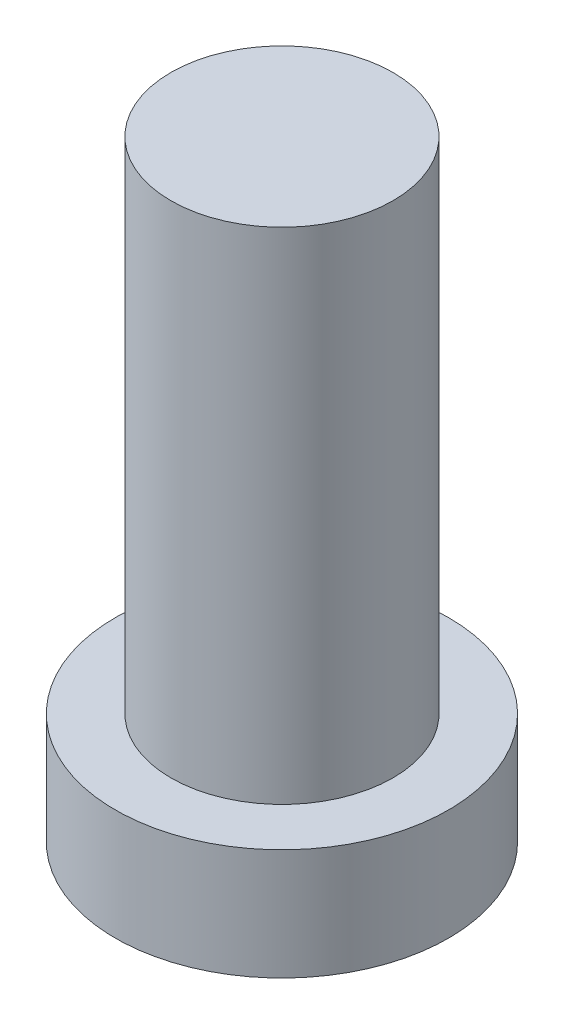
ISO-10303-21;
HEADER;
FILE_DESCRIPTION(('STEP AP214'),'2;1');
FILE_NAME('part.step','',(''),(''),'','','');
FILE_SCHEMA(('AUTOMOTIVE_DESIGN { 1 0 10303 214 1 1 1 1 }'));
ENDSEC;
DATA;
#1=APPLICATION_CONTEXT('core data for automotive mechanical design processes');
#2=APPLICATION_PROTOCOL_DEFINITION('international standard','automotive_design',2000,#1);
#3=PRODUCT_CONTEXT('',#1,'mechanical');
#4=PRODUCT('Part','Part','',(#3));
#5=PRODUCT_RELATED_PRODUCT_CATEGORY('part','',(#4));
#6=PRODUCT_DEFINITION_FORMATION('','',#4);
#7=PRODUCT_DEFINITION_CONTEXT('part definition',#1,'design');
#8=PRODUCT_DEFINITION('design','',#6,#7);
#9=PRODUCT_DEFINITION_SHAPE('','',#8);
#10=(LENGTH_UNIT() NAMED_UNIT(*) SI_UNIT(.MILLI.,.METRE.));
#11=(NAMED_UNIT(*) PLANE_ANGLE_UNIT() SI_UNIT($,.RADIAN.));
#12=(NAMED_UNIT(*) SI_UNIT($,.STERADIAN.) SOLID_ANGLE_UNIT());
#13=UNCERTAINTY_MEASURE_WITH_UNIT(LENGTH_MEASURE(1.E-05),#10,'distance_accuracy_value','');
#14=(GEOMETRIC_REPRESENTATION_CONTEXT(3) GLOBAL_UNCERTAINTY_ASSIGNED_CONTEXT((#13)) GLOBAL_UNIT_ASSIGNED_CONTEXT((#10,
#11,#12)) REPRESENTATION_CONTEXT('',''));
#15=CARTESIAN_POINT('',(0.,0.,0.));
#16=DIRECTION('',(0.,0.,1.));
#17=DIRECTION('',(1.,0.,0.));
#18=AXIS2_PLACEMENT_3D('',#15,#16,#17);
#19=CARTESIAN_POINT('',(0.,11.43,0.));
#20=DIRECTION('',(0.,-1.,0.));
#21=DIRECTION('',(0.,0.,-1.));
#22=AXIS2_PLACEMENT_3D('',#19,#20,#21);
#23=CYLINDRICAL_SURFACE('',#22,2.54);
#24=CARTESIAN_POINT('',(0.,11.43,0.));
#25=DIRECTION('',(0.,1.,0.));
#26=DIRECTION('',(0.,0.,1.));
#27=AXIS2_PLACEMENT_3D('',#24,#25,#26);
#28=CIRCLE('',#27,2.54);
#29=CARTESIAN_POINT('',(0.,11.43,2.54));
#30=VERTEX_POINT('',#29);
#31=EDGE_CURVE('E10',#30,#30,#28,.T.);
#32=ORIENTED_EDGE('',*,*,#31,.F.);
#33=EDGE_LOOP('',(#32));
#34=FACE_BOUND('',#33,.T.);
#35=CARTESIAN_POINT('',(0.,0.,0.));
#36=DIRECTION('',(0.,-1.,0.));
#37=DIRECTION('',(0.,0.,-1.));
#38=AXIS2_PLACEMENT_3D('',#35,#36,#37);
#39=CIRCLE('',#38,2.54);
#40=CARTESIAN_POINT('',(0.,0.,-2.54));
#41=VERTEX_POINT('',#40);
#42=EDGE_CURVE('E36',#41,#41,#39,.T.);
#43=ORIENTED_EDGE('',*,*,#42,.F.);
#44=EDGE_LOOP('',(#43));
#45=FACE_BOUND('',#44,.T.);
#46=ADVANCED_FACE('F30',(#34,#45),#23,.T.);
#47=CARTESIAN_POINT('',(0.,11.43,0.));
#48=DIRECTION('',(0.,1.,0.));
#49=DIRECTION('',(0.,0.,1.));
#50=AXIS2_PLACEMENT_3D('',#47,#48,#49);
#51=PLANE('',#50);
#52=ORIENTED_EDGE('',*,*,#31,.T.);
#53=EDGE_LOOP('',(#52));
#54=FACE_BOUND('',#53,.T.);
#55=ADVANCED_FACE('F63',(#54),#51,.T.);
#56=CARTESIAN_POINT('',(0.,-2.54,0.));
#57=DIRECTION('',(0.,1.,0.));
#58=DIRECTION('',(0.,0.,1.));
#59=AXIS2_PLACEMENT_3D('',#56,#57,#58);
#60=CYLINDRICAL_SURFACE('',#59,3.81);
#61=CARTESIAN_POINT('',(0.,-2.54,0.));
#62=DIRECTION('',(0.,-1.,0.));
#63=DIRECTION('',(0.,0.,-1.));
#64=AXIS2_PLACEMENT_3D('',#61,#62,#63);
#65=CIRCLE('',#64,3.81);
#66=CARTESIAN_POINT('',(0.,-2.54,-3.81));
#67=VERTEX_POINT('',#66);
#68=EDGE_CURVE('E40',#67,#67,#65,.T.);
#69=ORIENTED_EDGE('',*,*,#68,.F.);
#70=EDGE_LOOP('',(#69));
#71=FACE_BOUND('',#70,.T.);
#72=CARTESIAN_POINT('',(0.,0.,0.));
#73=DIRECTION('',(0.,-1.,0.));
#74=DIRECTION('',(0.,0.,-1.));
#75=AXIS2_PLACEMENT_3D('',#72,#73,#74);
#76=CIRCLE('',#75,3.81);
#77=CARTESIAN_POINT('',(0.,0.,-3.81));
#78=VERTEX_POINT('',#77);
#79=EDGE_CURVE('E44',#78,#78,#76,.T.);
#80=ORIENTED_EDGE('',*,*,#79,.T.);
#81=EDGE_LOOP('',(#80));
#82=FACE_BOUND('',#81,.T.);
#83=ADVANCED_FACE('F50',(#71,#82),#60,.T.);
#84=CARTESIAN_POINT('',(0.,-2.54,0.));
#85=DIRECTION('',(0.,-1.,0.));
#86=DIRECTION('',(0.,0.,-1.));
#87=AXIS2_PLACEMENT_3D('',#84,#85,#86);
#88=PLANE('',#87);
#89=ORIENTED_EDGE('',*,*,#68,.T.);
#90=EDGE_LOOP('',(#89));
#91=FACE_BOUND('',#90,.T.);
#92=ADVANCED_FACE('F54',(#91),#88,.T.);
#93=CARTESIAN_POINT('',(0.,0.,0.));
#94=DIRECTION('',(0.,-1.,0.));
#95=DIRECTION('',(0.,0.,-1.));
#96=AXIS2_PLACEMENT_3D('',#93,#94,#95);
#97=PLANE('',#96);
#98=ORIENTED_EDGE('',*,*,#42,.T.);
#99=EDGE_LOOP('',(#98));
#100=FACE_BOUND('',#99,.T.);
#101=ORIENTED_EDGE('',*,*,#79,.F.);
#102=EDGE_LOOP('',(#101));
#103=FACE_BOUND('',#102,.T.);
#104=ADVANCED_FACE('F52',(#100,#103),#97,.F.);
#105=CLOSED_SHELL('',(#46,#55,#83,#92,#104));
#106=MANIFOLD_SOLID_BREP('B2',#105);
#107=ADVANCED_BREP_SHAPE_REPRESENTATION('',(#18,#106),#14);
#108=SHAPE_DEFINITION_REPRESENTATION(#9,#107);
ENDSEC;
END-ISO-10303-21;
